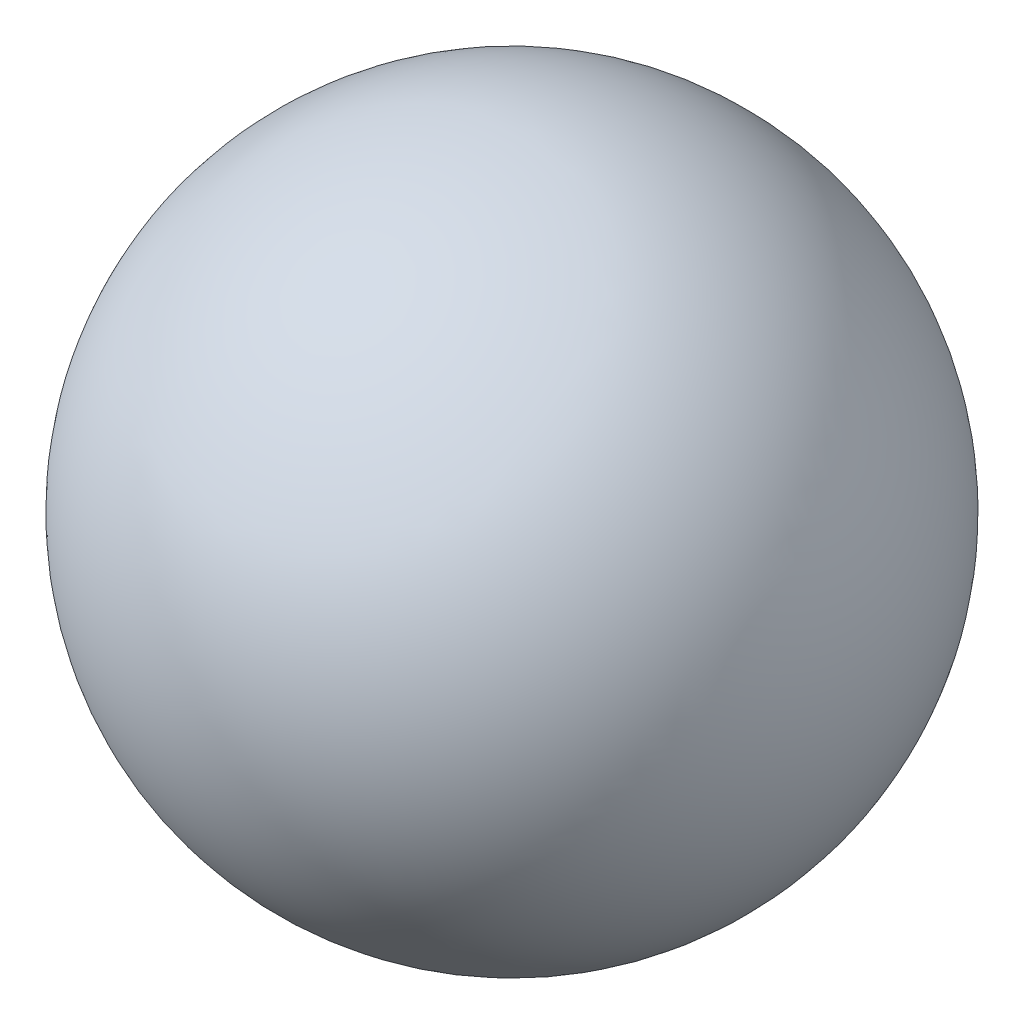
ISO-10303-21;
HEADER;
FILE_DESCRIPTION(('STEP AP214'),'2;1');
FILE_NAME('part.step','',(''),(''),'','','');
FILE_SCHEMA(('AUTOMOTIVE_DESIGN { 1 0 10303 214 1 1 1 1 }'));
ENDSEC;
DATA;
#1=APPLICATION_CONTEXT('core data for automotive mechanical design processes');
#2=APPLICATION_PROTOCOL_DEFINITION('international standard','automotive_design',2000,#1);
#3=PRODUCT_CONTEXT('',#1,'mechanical');
#4=PRODUCT('Part','Part','',(#3));
#5=PRODUCT_RELATED_PRODUCT_CATEGORY('part','',(#4));
#6=PRODUCT_DEFINITION_FORMATION('','',#4);
#7=PRODUCT_DEFINITION_CONTEXT('part definition',#1,'design');
#8=PRODUCT_DEFINITION('design','',#6,#7);
#9=PRODUCT_DEFINITION_SHAPE('','',#8);
#10=(LENGTH_UNIT() NAMED_UNIT(*) SI_UNIT(.MILLI.,.METRE.));
#11=(NAMED_UNIT(*) PLANE_ANGLE_UNIT() SI_UNIT($,.RADIAN.));
#12=(NAMED_UNIT(*) SI_UNIT($,.STERADIAN.) SOLID_ANGLE_UNIT());
#13=UNCERTAINTY_MEASURE_WITH_UNIT(LENGTH_MEASURE(1.E-05),#10,'distance_accuracy_value','');
#14=(GEOMETRIC_REPRESENTATION_CONTEXT(3) GLOBAL_UNCERTAINTY_ASSIGNED_CONTEXT((#13)) GLOBAL_UNIT_ASSIGNED_CONTEXT((#10,
#11,#12)) REPRESENTATION_CONTEXT('',''));
#15=CARTESIAN_POINT('',(0.,0.,0.));
#16=DIRECTION('',(0.,0.,1.));
#17=DIRECTION('',(1.,0.,0.));
#18=AXIS2_PLACEMENT_3D('',#15,#16,#17);
#19=CARTESIAN_POINT('',(0.,0.,0.));
#20=DIRECTION('',(-1.,0.,0.));
#21=DIRECTION('',(0.,1.,0.));
#22=AXIS2_PLACEMENT_3D('',#19,#20,#21);
#23=SPHERICAL_SURFACE('',#22,16.96333332);
#24=CARTESIAN_POINT('',(-16.96333332,0.,0.));
#25=VERTEX_POINT('',#24);
#26=VERTEX_LOOP('',#25);
#27=FACE_BOUND('',#26,.T.);
#28=ADVANCED_FACE('F32',(#27),#23,.T.);
#29=CLOSED_SHELL('',(#28));
#30=MANIFOLD_SOLID_BREP('B2',#29);
#31=ADVANCED_BREP_SHAPE_REPRESENTATION('',(#18,#30),#14);
#32=SHAPE_DEFINITION_REPRESENTATION(#9,#31);
ENDSEC;
END-ISO-10303-21;
